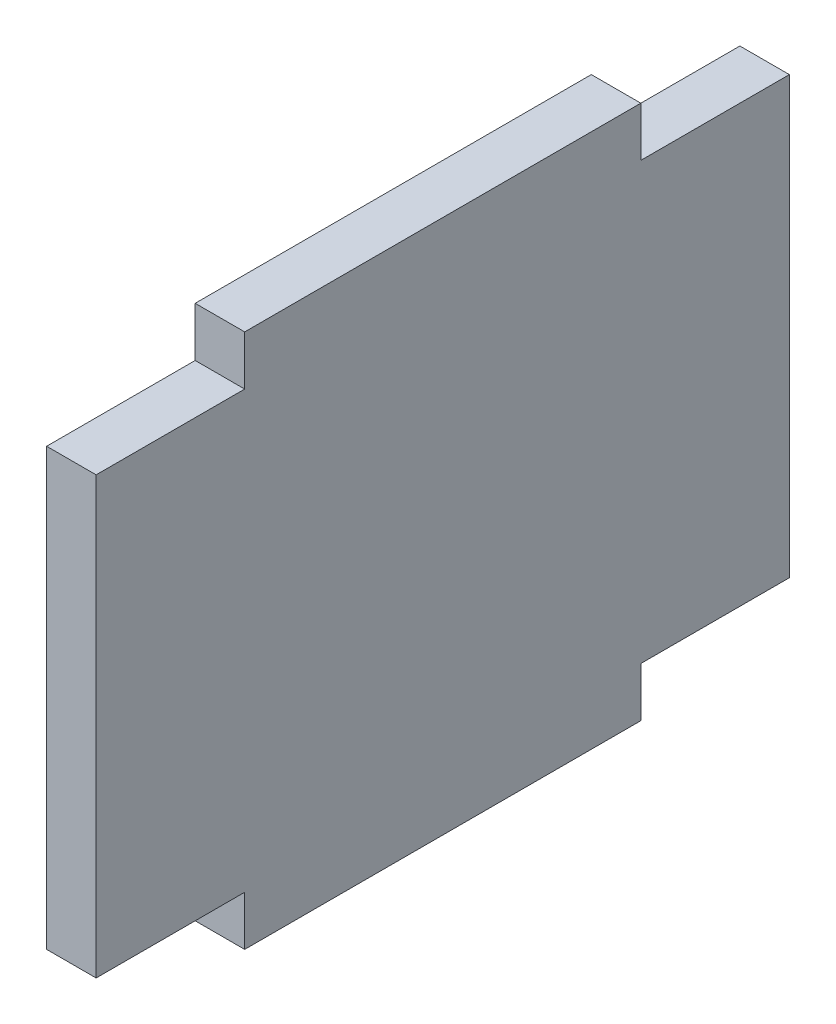
ISO-10303-21;
HEADER;
FILE_DESCRIPTION(('STEP AP214'),'2;1');
FILE_NAME('part.step','',(''),(''),'','','');
FILE_SCHEMA(('AUTOMOTIVE_DESIGN { 1 0 10303 214 1 1 1 1 }'));
ENDSEC;
DATA;
#1=APPLICATION_CONTEXT('core data for automotive mechanical design processes');
#2=APPLICATION_PROTOCOL_DEFINITION('international standard','automotive_design',2000,#1);
#3=PRODUCT_CONTEXT('',#1,'mechanical');
#4=PRODUCT('Part','Part','',(#3));
#5=PRODUCT_RELATED_PRODUCT_CATEGORY('part','',(#4));
#6=PRODUCT_DEFINITION_FORMATION('','',#4);
#7=PRODUCT_DEFINITION_CONTEXT('part definition',#1,'design');
#8=PRODUCT_DEFINITION('design','',#6,#7);
#9=PRODUCT_DEFINITION_SHAPE('','',#8);
#10=(LENGTH_UNIT() NAMED_UNIT(*) SI_UNIT(.MILLI.,.METRE.));
#11=(NAMED_UNIT(*) PLANE_ANGLE_UNIT() SI_UNIT($,.RADIAN.));
#12=(NAMED_UNIT(*) SI_UNIT($,.STERADIAN.) SOLID_ANGLE_UNIT());
#13=UNCERTAINTY_MEASURE_WITH_UNIT(LENGTH_MEASURE(1.E-05),#10,'distance_accuracy_value','');
#14=(GEOMETRIC_REPRESENTATION_CONTEXT(3) GLOBAL_UNCERTAINTY_ASSIGNED_CONTEXT((#13)) GLOBAL_UNIT_ASSIGNED_CONTEXT((#10,
#11,#12)) REPRESENTATION_CONTEXT('',''));
#15=CARTESIAN_POINT('',(0.,0.,0.));
#16=DIRECTION('',(0.,0.,1.));
#17=DIRECTION('',(1.,0.,0.));
#18=AXIS2_PLACEMENT_3D('',#15,#16,#17);
#19=CARTESIAN_POINT('',(1.25,11.,-17.5));
#20=DIRECTION('',(0.,-1.,0.));
#21=DIRECTION('',(0.,0.,-1.));
#22=AXIS2_PLACEMENT_3D('',#19,#20,#21);
#23=PLANE('',#22);
#24=DIRECTION('',(0.,0.,1.));
#25=VECTOR('',#24,1.);
#26=CARTESIAN_POINT('',(-1.25,11.,-17.5));
#27=LINE('',#26,#25);
#28=CARTESIAN_POINT('',(-1.25,11.,-17.5));
#29=VERTEX_POINT('',#28);
#30=CARTESIAN_POINT('',(-1.25,11.,-10.));
#31=VERTEX_POINT('',#30);
#32=EDGE_CURVE('E154',#29,#31,#27,.T.);
#33=ORIENTED_EDGE('',*,*,#32,.T.);
#34=DIRECTION('',(-1.,0.,0.));
#35=VECTOR('',#34,1.);
#36=CARTESIAN_POINT('',(1.25,11.,-10.));
#37=LINE('',#36,#35);
#38=CARTESIAN_POINT('',(1.25,11.,-10.));
#39=VERTEX_POINT('',#38);
#40=EDGE_CURVE('E11',#39,#31,#37,.T.);
#41=ORIENTED_EDGE('',*,*,#40,.F.);
#42=DIRECTION('',(0.,0.,1.));
#43=VECTOR('',#42,1.);
#44=CARTESIAN_POINT('',(1.25,11.,-17.5));
#45=LINE('',#44,#43);
#46=CARTESIAN_POINT('',(1.25,11.,-17.5));
#47=VERTEX_POINT('',#46);
#48=EDGE_CURVE('E176',#47,#39,#45,.T.);
#49=ORIENTED_EDGE('',*,*,#48,.F.);
#50=DIRECTION('',(-1.,0.,0.));
#51=VECTOR('',#50,1.);
#52=CARTESIAN_POINT('',(1.25,11.,-17.5));
#53=LINE('',#52,#51);
#54=EDGE_CURVE('E150',#47,#29,#53,.T.);
#55=ORIENTED_EDGE('',*,*,#54,.T.);
#56=EDGE_LOOP('',(#33,#41,#49,#55));
#57=FACE_BOUND('',#56,.T.);
#58=ADVANCED_FACE('F34',(#57),#23,.F.);
#59=CARTESIAN_POINT('',(1.25,13.5,-10.));
#60=DIRECTION('',(0.,0.,1.));
#61=DIRECTION('',(1.,0.,0.));
#62=AXIS2_PLACEMENT_3D('',#59,#60,#61);
#63=PLANE('',#62);
#64=DIRECTION('',(0.,1.,0.));
#65=VECTOR('',#64,1.);
#66=CARTESIAN_POINT('',(-1.25,13.5,-10.));
#67=LINE('',#66,#65);
#68=CARTESIAN_POINT('',(-1.25,13.5,-10.));
#69=VERTEX_POINT('',#68);
#70=EDGE_CURVE('E157',#31,#69,#67,.T.);
#71=ORIENTED_EDGE('',*,*,#70,.T.);
#72=DIRECTION('',(-1.,0.,0.));
#73=VECTOR('',#72,1.);
#74=CARTESIAN_POINT('',(1.25,13.5,-10.));
#75=LINE('',#74,#73);
#76=CARTESIAN_POINT('',(1.25,13.5,-10.));
#77=VERTEX_POINT('',#76);
#78=EDGE_CURVE('E42',#77,#69,#75,.T.);
#79=ORIENTED_EDGE('',*,*,#78,.F.);
#80=DIRECTION('',(0.,1.,0.));
#81=VECTOR('',#80,1.);
#82=CARTESIAN_POINT('',(1.25,13.5,-10.));
#83=LINE('',#82,#81);
#84=EDGE_CURVE('E105',#39,#77,#83,.T.);
#85=ORIENTED_EDGE('',*,*,#84,.F.);
#86=ORIENTED_EDGE('',*,*,#40,.T.);
#87=EDGE_LOOP('',(#71,#79,#85,#86));
#88=FACE_BOUND('',#87,.T.);
#89=ADVANCED_FACE('F254',(#88),#63,.F.);
#90=CARTESIAN_POINT('',(1.25,13.5,10.));
#91=DIRECTION('',(0.,-1.,0.));
#92=DIRECTION('',(0.,0.,-1.));
#93=AXIS2_PLACEMENT_3D('',#90,#91,#92);
#94=PLANE('',#93);
#95=DIRECTION('',(0.,0.,1.));
#96=VECTOR('',#95,1.);
#97=CARTESIAN_POINT('',(-1.25,13.5,10.));
#98=LINE('',#97,#96);
#99=CARTESIAN_POINT('',(-1.25,13.5,10.));
#100=VERTEX_POINT('',#99);
#101=EDGE_CURVE('E159',#69,#100,#98,.T.);
#102=ORIENTED_EDGE('',*,*,#101,.T.);
#103=DIRECTION('',(-1.,0.,0.));
#104=VECTOR('',#103,1.);
#105=CARTESIAN_POINT('',(1.25,13.5,10.));
#106=LINE('',#105,#104);
#107=CARTESIAN_POINT('',(1.25,13.5,10.));
#108=VERTEX_POINT('',#107);
#109=EDGE_CURVE('E195',#108,#100,#106,.T.);
#110=ORIENTED_EDGE('',*,*,#109,.F.);
#111=DIRECTION('',(0.,0.,1.));
#112=VECTOR('',#111,1.);
#113=CARTESIAN_POINT('',(1.25,13.5,10.));
#114=LINE('',#113,#112);
#115=EDGE_CURVE('E203',#77,#108,#114,.T.);
#116=ORIENTED_EDGE('',*,*,#115,.F.);
#117=ORIENTED_EDGE('',*,*,#78,.T.);
#118=EDGE_LOOP('',(#102,#110,#116,#117));
#119=FACE_BOUND('',#118,.T.);
#120=ADVANCED_FACE('F201',(#119),#94,.F.);
#121=CARTESIAN_POINT('',(1.25,13.5,10.));
#122=DIRECTION('',(0.,0.,-1.));
#123=DIRECTION('',(-1.,0.,0.));
#124=AXIS2_PLACEMENT_3D('',#121,#122,#123);
#125=PLANE('',#124);
#126=DIRECTION('',(0.,-1.,0.));
#127=VECTOR('',#126,1.);
#128=CARTESIAN_POINT('',(-1.25,13.5,10.));
#129=LINE('',#128,#127);
#130=CARTESIAN_POINT('',(-1.25,11.,10.));
#131=VERTEX_POINT('',#130);
#132=EDGE_CURVE('E161',#100,#131,#129,.T.);
#133=ORIENTED_EDGE('',*,*,#132,.T.);
#134=DIRECTION('',(-1.,0.,0.));
#135=VECTOR('',#134,1.);
#136=CARTESIAN_POINT('',(1.25,11.,10.));
#137=LINE('',#136,#135);
#138=CARTESIAN_POINT('',(1.25,11.,10.));
#139=VERTEX_POINT('',#138);
#140=EDGE_CURVE('E192',#139,#131,#137,.T.);
#141=ORIENTED_EDGE('',*,*,#140,.F.);
#142=DIRECTION('',(0.,-1.,0.));
#143=VECTOR('',#142,1.);
#144=CARTESIAN_POINT('',(1.25,13.5,10.));
#145=LINE('',#144,#143);
#146=EDGE_CURVE('E221',#108,#139,#145,.T.);
#147=ORIENTED_EDGE('',*,*,#146,.F.);
#148=ORIENTED_EDGE('',*,*,#109,.T.);
#149=EDGE_LOOP('',(#133,#141,#147,#148));
#150=FACE_BOUND('',#149,.T.);
#151=ADVANCED_FACE('F212',(#150),#125,.F.);
#152=CARTESIAN_POINT('',(1.25,11.,10.));
#153=DIRECTION('',(0.,-1.,0.));
#154=DIRECTION('',(0.,0.,-1.));
#155=AXIS2_PLACEMENT_3D('',#152,#153,#154);
#156=PLANE('',#155);
#157=DIRECTION('',(0.,0.,1.));
#158=VECTOR('',#157,1.);
#159=CARTESIAN_POINT('',(-1.25,11.,10.));
#160=LINE('',#159,#158);
#161=CARTESIAN_POINT('',(-1.25,11.,17.5));
#162=VERTEX_POINT('',#161);
#163=EDGE_CURVE('E163',#131,#162,#160,.T.);
#164=ORIENTED_EDGE('',*,*,#163,.T.);
#165=DIRECTION('',(-1.,0.,0.));
#166=VECTOR('',#165,1.);
#167=CARTESIAN_POINT('',(1.25,11.,17.5));
#168=LINE('',#167,#166);
#169=CARTESIAN_POINT('',(1.25,11.,17.5));
#170=VERTEX_POINT('',#169);
#171=EDGE_CURVE('E189',#170,#162,#168,.T.);
#172=ORIENTED_EDGE('',*,*,#171,.F.);
#173=DIRECTION('',(0.,0.,1.));
#174=VECTOR('',#173,1.);
#175=CARTESIAN_POINT('',(1.25,11.,10.));
#176=LINE('',#175,#174);
#177=EDGE_CURVE('E218',#139,#170,#176,.T.);
#178=ORIENTED_EDGE('',*,*,#177,.F.);
#179=ORIENTED_EDGE('',*,*,#140,.T.);
#180=EDGE_LOOP('',(#164,#172,#178,#179));
#181=FACE_BOUND('',#180,.T.);
#182=ADVANCED_FACE('F216',(#181),#156,.F.);
#183=CARTESIAN_POINT('',(1.25,-11.,17.5));
#184=DIRECTION('',(0.,0.,-1.));
#185=DIRECTION('',(0.,1.,0.));
#186=AXIS2_PLACEMENT_3D('',#183,#184,#185);
#187=PLANE('',#186);
#188=DIRECTION('',(0.,-1.,0.));
#189=VECTOR('',#188,1.);
#190=CARTESIAN_POINT('',(-1.25,-11.,17.5));
#191=LINE('',#190,#189);
#192=CARTESIAN_POINT('',(-1.25,-11.,17.5));
#193=VERTEX_POINT('',#192);
#194=EDGE_CURVE('E165',#162,#193,#191,.T.);
#195=ORIENTED_EDGE('',*,*,#194,.T.);
#196=DIRECTION('',(-1.,0.,0.));
#197=VECTOR('',#196,1.);
#198=CARTESIAN_POINT('',(1.25,-11.,17.5));
#199=LINE('',#198,#197);
#200=CARTESIAN_POINT('',(1.25,-11.,17.5));
#201=VERTEX_POINT('',#200);
#202=EDGE_CURVE('E186',#201,#193,#199,.T.);
#203=ORIENTED_EDGE('',*,*,#202,.F.);
#204=DIRECTION('',(0.,-1.,0.));
#205=VECTOR('',#204,1.);
#206=CARTESIAN_POINT('',(1.25,-11.,17.5));
#207=LINE('',#206,#205);
#208=EDGE_CURVE('E220',#170,#201,#207,.T.);
#209=ORIENTED_EDGE('',*,*,#208,.F.);
#210=ORIENTED_EDGE('',*,*,#171,.T.);
#211=EDGE_LOOP('',(#195,#203,#209,#210));
#212=FACE_BOUND('',#211,.T.);
#213=ADVANCED_FACE('F267',(#212),#187,.F.);
#214=CARTESIAN_POINT('',(1.25,-11.,17.5));
#215=DIRECTION('',(0.,1.,0.));
#216=DIRECTION('',(0.,0.,1.));
#217=AXIS2_PLACEMENT_3D('',#214,#215,#216);
#218=PLANE('',#217);
#219=DIRECTION('',(0.,0.,-1.));
#220=VECTOR('',#219,1.);
#221=CARTESIAN_POINT('',(-1.25,-11.,17.5));
#222=LINE('',#221,#220);
#223=CARTESIAN_POINT('',(-1.25,-11.,10.));
#224=VERTEX_POINT('',#223);
#225=EDGE_CURVE('E167',#193,#224,#222,.T.);
#226=ORIENTED_EDGE('',*,*,#225,.T.);
#227=DIRECTION('',(-1.,0.,0.));
#228=VECTOR('',#227,1.);
#229=CARTESIAN_POINT('',(1.25,-11.,10.));
#230=LINE('',#229,#228);
#231=CARTESIAN_POINT('',(1.25,-11.,10.));
#232=VERTEX_POINT('',#231);
#233=EDGE_CURVE('E183',#232,#224,#230,.T.);
#234=ORIENTED_EDGE('',*,*,#233,.F.);
#235=DIRECTION('',(0.,0.,-1.));
#236=VECTOR('',#235,1.);
#237=CARTESIAN_POINT('',(1.25,-11.,17.5));
#238=LINE('',#237,#236);
#239=EDGE_CURVE('E223',#201,#232,#238,.T.);
#240=ORIENTED_EDGE('',*,*,#239,.F.);
#241=ORIENTED_EDGE('',*,*,#202,.T.);
#242=EDGE_LOOP('',(#226,#234,#240,#241));
#243=FACE_BOUND('',#242,.T.);
#244=ADVANCED_FACE('F270',(#243),#218,.F.);
#245=CARTESIAN_POINT('',(1.25,-13.5,10.));
#246=DIRECTION('',(0.,0.,-1.));
#247=DIRECTION('',(-1.,0.,0.));
#248=AXIS2_PLACEMENT_3D('',#245,#246,#247);
#249=PLANE('',#248);
#250=DIRECTION('',(0.,-1.,0.));
#251=VECTOR('',#250,1.);
#252=CARTESIAN_POINT('',(-1.25,-13.5,10.));
#253=LINE('',#252,#251);
#254=CARTESIAN_POINT('',(-1.25,-13.5,10.));
#255=VERTEX_POINT('',#254);
#256=EDGE_CURVE('E169',#224,#255,#253,.T.);
#257=ORIENTED_EDGE('',*,*,#256,.T.);
#258=DIRECTION('',(-1.,0.,0.));
#259=VECTOR('',#258,1.);
#260=CARTESIAN_POINT('',(1.25,-13.5,10.));
#261=LINE('',#260,#259);
#262=CARTESIAN_POINT('',(1.25,-13.5,10.));
#263=VERTEX_POINT('',#262);
#264=EDGE_CURVE('E180',#263,#255,#261,.T.);
#265=ORIENTED_EDGE('',*,*,#264,.F.);
#266=DIRECTION('',(0.,-1.,0.));
#267=VECTOR('',#266,1.);
#268=CARTESIAN_POINT('',(1.25,-13.5,10.));
#269=LINE('',#268,#267);
#270=EDGE_CURVE('E229',#232,#263,#269,.T.);
#271=ORIENTED_EDGE('',*,*,#270,.F.);
#272=ORIENTED_EDGE('',*,*,#233,.T.);
#273=EDGE_LOOP('',(#257,#265,#271,#272));
#274=FACE_BOUND('',#273,.T.);
#275=ADVANCED_FACE('F235',(#274),#249,.F.);
#276=CARTESIAN_POINT('',(1.25,-13.5,10.));
#277=DIRECTION('',(0.,1.,0.));
#278=DIRECTION('',(0.,0.,1.));
#279=AXIS2_PLACEMENT_3D('',#276,#277,#278);
#280=PLANE('',#279);
#281=DIRECTION('',(0.,0.,-1.));
#282=VECTOR('',#281,1.);
#283=CARTESIAN_POINT('',(-1.25,-13.5,10.));
#284=LINE('',#283,#282);
#285=CARTESIAN_POINT('',(-1.25,-13.5,-10.));
#286=VERTEX_POINT('',#285);
#287=EDGE_CURVE('E171',#255,#286,#284,.T.);
#288=ORIENTED_EDGE('',*,*,#287,.T.);
#289=DIRECTION('',(-1.,0.,0.));
#290=VECTOR('',#289,1.);
#291=CARTESIAN_POINT('',(1.25,-13.5,-10.));
#292=LINE('',#291,#290);
#293=CARTESIAN_POINT('',(1.25,-13.5,-10.));
#294=VERTEX_POINT('',#293);
#295=EDGE_CURVE('E145',#294,#286,#292,.T.);
#296=ORIENTED_EDGE('',*,*,#295,.F.);
#297=DIRECTION('',(0.,0.,-1.));
#298=VECTOR('',#297,1.);
#299=CARTESIAN_POINT('',(1.25,-13.5,10.));
#300=LINE('',#299,#298);
#301=EDGE_CURVE('E136',#263,#294,#300,.T.);
#302=ORIENTED_EDGE('',*,*,#301,.F.);
#303=ORIENTED_EDGE('',*,*,#264,.T.);
#304=EDGE_LOOP('',(#288,#296,#302,#303));
#305=FACE_BOUND('',#304,.T.);
#306=ADVANCED_FACE('F239',(#305),#280,.F.);
#307=CARTESIAN_POINT('',(1.25,-13.5,-10.));
#308=DIRECTION('',(0.,0.,1.));
#309=DIRECTION('',(1.,0.,0.));
#310=AXIS2_PLACEMENT_3D('',#307,#308,#309);
#311=PLANE('',#310);
#312=DIRECTION('',(0.,1.,0.));
#313=VECTOR('',#312,1.);
#314=CARTESIAN_POINT('',(-1.25,-13.5,-10.));
#315=LINE('',#314,#313);
#316=CARTESIAN_POINT('',(-1.25,-11.,-10.));
#317=VERTEX_POINT('',#316);
#318=EDGE_CURVE('E144',#286,#317,#315,.T.);
#319=ORIENTED_EDGE('',*,*,#318,.T.);
#320=DIRECTION('',(-1.,0.,0.));
#321=VECTOR('',#320,1.);
#322=CARTESIAN_POINT('',(1.25,-11.,-10.));
#323=LINE('',#322,#321);
#324=CARTESIAN_POINT('',(1.25,-11.,-10.));
#325=VERTEX_POINT('',#324);
#326=EDGE_CURVE('E141',#325,#317,#323,.T.);
#327=ORIENTED_EDGE('',*,*,#326,.F.);
#328=DIRECTION('',(0.,1.,0.));
#329=VECTOR('',#328,1.);
#330=CARTESIAN_POINT('',(1.25,-13.5,-10.));
#331=LINE('',#330,#329);
#332=EDGE_CURVE('E130',#294,#325,#331,.T.);
#333=ORIENTED_EDGE('',*,*,#332,.F.);
#334=ORIENTED_EDGE('',*,*,#295,.T.);
#335=EDGE_LOOP('',(#319,#327,#333,#334));
#336=FACE_BOUND('',#335,.T.);
#337=ADVANCED_FACE('F142',(#336),#311,.F.);
#338=CARTESIAN_POINT('',(1.25,-11.,-10.));
#339=DIRECTION('',(0.,1.,0.));
#340=DIRECTION('',(0.,0.,1.));
#341=AXIS2_PLACEMENT_3D('',#338,#339,#340);
#342=PLANE('',#341);
#343=DIRECTION('',(0.,0.,-1.));
#344=VECTOR('',#343,1.);
#345=CARTESIAN_POINT('',(-1.25,-11.,-10.));
#346=LINE('',#345,#344);
#347=CARTESIAN_POINT('',(-1.25,-11.,-17.5));
#348=VERTEX_POINT('',#347);
#349=EDGE_CURVE('E91',#317,#348,#346,.T.);
#350=ORIENTED_EDGE('',*,*,#349,.T.);
#351=DIRECTION('',(-1.,0.,0.));
#352=VECTOR('',#351,1.);
#353=CARTESIAN_POINT('',(1.25,-11.,-17.5));
#354=LINE('',#353,#352);
#355=CARTESIAN_POINT('',(1.25,-11.,-17.5));
#356=VERTEX_POINT('',#355);
#357=EDGE_CURVE('E146',#356,#348,#354,.T.);
#358=ORIENTED_EDGE('',*,*,#357,.F.);
#359=DIRECTION('',(0.,0.,-1.));
#360=VECTOR('',#359,1.);
#361=CARTESIAN_POINT('',(1.25,-11.,-10.));
#362=LINE('',#361,#360);
#363=EDGE_CURVE('E134',#325,#356,#362,.T.);
#364=ORIENTED_EDGE('',*,*,#363,.F.);
#365=ORIENTED_EDGE('',*,*,#326,.T.);
#366=EDGE_LOOP('',(#350,#358,#364,#365));
#367=FACE_BOUND('',#366,.T.);
#368=ADVANCED_FACE('F148',(#367),#342,.F.);
#369=CARTESIAN_POINT('',(1.25,-11.,-17.5));
#370=DIRECTION('',(0.,0.,1.));
#371=DIRECTION('',(0.,-1.,0.));
#372=AXIS2_PLACEMENT_3D('',#369,#370,#371);
#373=PLANE('',#372);
#374=DIRECTION('',(0.,1.,0.));
#375=VECTOR('',#374,1.);
#376=CARTESIAN_POINT('',(-1.25,-11.,-17.5));
#377=LINE('',#376,#375);
#378=EDGE_CURVE('E97',#348,#29,#377,.T.);
#379=ORIENTED_EDGE('',*,*,#378,.T.);
#380=ORIENTED_EDGE('',*,*,#54,.F.);
#381=DIRECTION('',(0.,1.,0.));
#382=VECTOR('',#381,1.);
#383=CARTESIAN_POINT('',(1.25,-11.,-17.5));
#384=LINE('',#383,#382);
#385=EDGE_CURVE('E50',#356,#47,#384,.T.);
#386=ORIENTED_EDGE('',*,*,#385,.F.);
#387=ORIENTED_EDGE('',*,*,#357,.T.);
#388=EDGE_LOOP('',(#379,#380,#386,#387));
#389=FACE_BOUND('',#388,.T.);
#390=ADVANCED_FACE('F243',(#389),#373,.F.);
#391=CARTESIAN_POINT('',(1.25,0.,0.));
#392=DIRECTION('',(1.,0.,0.));
#393=DIRECTION('',(0.,0.,-1.));
#394=AXIS2_PLACEMENT_3D('',#391,#392,#393);
#395=PLANE('',#394);
#396=ORIENTED_EDGE('',*,*,#48,.T.);
#397=ORIENTED_EDGE('',*,*,#84,.T.);
#398=ORIENTED_EDGE('',*,*,#115,.T.);
#399=ORIENTED_EDGE('',*,*,#146,.T.);
#400=ORIENTED_EDGE('',*,*,#177,.T.);
#401=ORIENTED_EDGE('',*,*,#208,.T.);
#402=ORIENTED_EDGE('',*,*,#239,.T.);
#403=ORIENTED_EDGE('',*,*,#270,.T.);
#404=ORIENTED_EDGE('',*,*,#301,.T.);
#405=ORIENTED_EDGE('',*,*,#332,.T.);
#406=ORIENTED_EDGE('',*,*,#363,.T.);
#407=ORIENTED_EDGE('',*,*,#385,.T.);
#408=EDGE_LOOP('',(#396,#397,#398,#399,#400,#401,#402,#403,#404,#405,#406,#407));
#409=FACE_BOUND('',#408,.T.);
#410=ADVANCED_FACE('F132',(#409),#395,.T.);
#411=CARTESIAN_POINT('',(-1.25,0.,0.));
#412=DIRECTION('',(1.,0.,0.));
#413=DIRECTION('',(0.,0.,-1.));
#414=AXIS2_PLACEMENT_3D('',#411,#412,#413);
#415=PLANE('',#414);
#416=ORIENTED_EDGE('',*,*,#32,.F.);
#417=ORIENTED_EDGE('',*,*,#378,.F.);
#418=ORIENTED_EDGE('',*,*,#349,.F.);
#419=ORIENTED_EDGE('',*,*,#318,.F.);
#420=ORIENTED_EDGE('',*,*,#287,.F.);
#421=ORIENTED_EDGE('',*,*,#256,.F.);
#422=ORIENTED_EDGE('',*,*,#225,.F.);
#423=ORIENTED_EDGE('',*,*,#194,.F.);
#424=ORIENTED_EDGE('',*,*,#163,.F.);
#425=ORIENTED_EDGE('',*,*,#132,.F.);
#426=ORIENTED_EDGE('',*,*,#101,.F.);
#427=ORIENTED_EDGE('',*,*,#70,.F.);
#428=EDGE_LOOP('',(#416,#417,#418,#419,#420,#421,#422,#423,#424,#425,#426,#427));
#429=FACE_BOUND('',#428,.T.);
#430=ADVANCED_FACE('F207',(#429),#415,.F.);
#431=CLOSED_SHELL('',(#58,#89,#120,#151,#182,#213,#244,#275,#306,#337,#368,#390,#410,#430));
#432=MANIFOLD_SOLID_BREP('B2',#431);
#433=ADVANCED_BREP_SHAPE_REPRESENTATION('',(#18,#432),#14);
#434=SHAPE_DEFINITION_REPRESENTATION(#9,#433);
ENDSEC;
END-ISO-10303-21;
